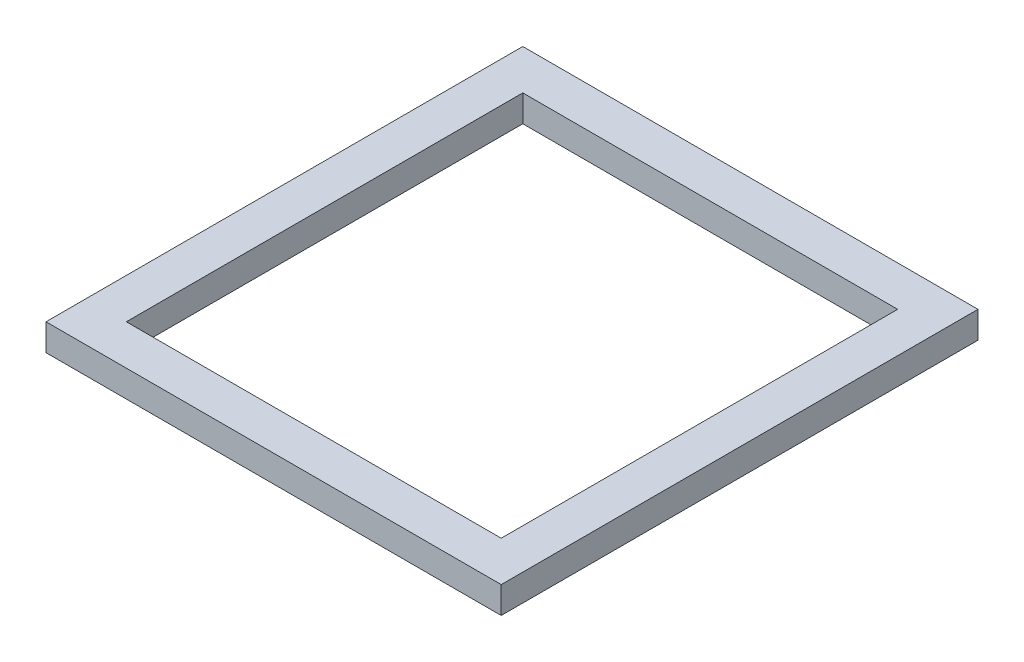
ISO-10303-21;
HEADER;
FILE_DESCRIPTION(('STEP AP214'),'2;1');
FILE_NAME('part.step','',(''),(''),'','','');
FILE_SCHEMA(('AUTOMOTIVE_DESIGN { 1 0 10303 214 1 1 1 1 }'));
ENDSEC;
DATA;
#1=APPLICATION_CONTEXT('core data for automotive mechanical design processes');
#2=APPLICATION_PROTOCOL_DEFINITION('international standard','automotive_design',2000,#1);
#3=PRODUCT_CONTEXT('',#1,'mechanical');
#4=PRODUCT('Part','Part','',(#3));
#5=PRODUCT_RELATED_PRODUCT_CATEGORY('part','',(#4));
#6=PRODUCT_DEFINITION_FORMATION('','',#4);
#7=PRODUCT_DEFINITION_CONTEXT('part definition',#1,'design');
#8=PRODUCT_DEFINITION('design','',#6,#7);
#9=PRODUCT_DEFINITION_SHAPE('','',#8);
#10=(LENGTH_UNIT() NAMED_UNIT(*) SI_UNIT(.MILLI.,.METRE.));
#11=(NAMED_UNIT(*) PLANE_ANGLE_UNIT() SI_UNIT($,.RADIAN.));
#12=(NAMED_UNIT(*) SI_UNIT($,.STERADIAN.) SOLID_ANGLE_UNIT());
#13=UNCERTAINTY_MEASURE_WITH_UNIT(LENGTH_MEASURE(1.E-05),#10,'distance_accuracy_value','');
#14=(GEOMETRIC_REPRESENTATION_CONTEXT(3) GLOBAL_UNCERTAINTY_ASSIGNED_CONTEXT((#13)) GLOBAL_UNIT_ASSIGNED_CONTEXT((#10,
#11,#12)) REPRESENTATION_CONTEXT('',''));
#15=CARTESIAN_POINT('',(0.,0.,0.));
#16=DIRECTION('',(0.,0.,1.));
#17=DIRECTION('',(1.,0.,0.));
#18=AXIS2_PLACEMENT_3D('',#15,#16,#17);
#19=CARTESIAN_POINT('',(0.,1.5875,0.));
#20=DIRECTION('',(0.,-1.,0.));
#21=DIRECTION('',(0.,0.,-1.));
#22=AXIS2_PLACEMENT_3D('',#19,#20,#21);
#23=PLANE('',#22);
#24=DIRECTION('',(0.,0.,1.));
#25=VECTOR('',#24,1.);
#26=CARTESIAN_POINT('',(0.,1.5875,0.));
#27=LINE('',#26,#25);
#28=CARTESIAN_POINT('',(0.,1.5875,-28.2675));
#29=VERTEX_POINT('',#28);
#30=CARTESIAN_POINT('',(0.,1.5875,0.));
#31=VERTEX_POINT('',#30);
#32=EDGE_CURVE('E142',#29,#31,#27,.T.);
#33=ORIENTED_EDGE('',*,*,#32,.T.);
#34=DIRECTION('',(1.,0.,0.));
#35=VECTOR('',#34,1.);
#36=CARTESIAN_POINT('',(0.,1.5875,0.));
#37=LINE('',#36,#35);
#38=CARTESIAN_POINT('',(26.9875,1.5875,0.));
#39=VERTEX_POINT('',#38);
#40=EDGE_CURVE('E145',#31,#39,#37,.T.);
#41=ORIENTED_EDGE('',*,*,#40,.T.);
#42=DIRECTION('',(0.,0.,-1.));
#43=VECTOR('',#42,1.);
#44=CARTESIAN_POINT('',(26.9875,1.5875,0.));
#45=LINE('',#44,#43);
#46=CARTESIAN_POINT('',(26.9875,1.5875,-28.2675));
#47=VERTEX_POINT('',#46);
#48=EDGE_CURVE('E148',#39,#47,#45,.T.);
#49=ORIENTED_EDGE('',*,*,#48,.T.);
#50=DIRECTION('',(-1.,0.,0.));
#51=VECTOR('',#50,1.);
#52=CARTESIAN_POINT('',(0.,1.5875,-28.2675));
#53=LINE('',#52,#51);
#54=EDGE_CURVE('E150',#47,#29,#53,.T.);
#55=ORIENTED_EDGE('',*,*,#54,.T.);
#56=EDGE_LOOP('',(#33,#41,#49,#55));
#57=FACE_BOUND('',#56,.T.);
#58=DIRECTION('',(0.,0.,1.));
#59=VECTOR('',#58,1.);
#60=CARTESIAN_POINT('',(2.38125,1.5875,-2.38125));
#61=LINE('',#60,#59);
#62=CARTESIAN_POINT('',(2.38125,1.5875,-25.88625));
#63=VERTEX_POINT('',#62);
#64=CARTESIAN_POINT('',(2.38125,1.5875,-2.38125));
#65=VERTEX_POINT('',#64);
#66=EDGE_CURVE('E106',#63,#65,#61,.T.);
#67=ORIENTED_EDGE('',*,*,#66,.F.);
#68=DIRECTION('',(-1.,0.,0.));
#69=VECTOR('',#68,1.);
#70=CARTESIAN_POINT('',(2.38125,1.5875,-25.88625));
#71=LINE('',#70,#69);
#72=CARTESIAN_POINT('',(24.60625,1.5875,-25.88625));
#73=VERTEX_POINT('',#72);
#74=EDGE_CURVE('E128',#73,#63,#71,.T.);
#75=ORIENTED_EDGE('',*,*,#74,.F.);
#76=DIRECTION('',(0.,0.,-1.));
#77=VECTOR('',#76,1.);
#78=CARTESIAN_POINT('',(24.60625,1.5875,-2.38125));
#79=LINE('',#78,#77);
#80=CARTESIAN_POINT('',(24.60625,1.5875,-2.38125));
#81=VERTEX_POINT('',#80);
#82=EDGE_CURVE('E126',#81,#73,#79,.T.);
#83=ORIENTED_EDGE('',*,*,#82,.F.);
#84=DIRECTION('',(1.,0.,0.));
#85=VECTOR('',#84,1.);
#86=CARTESIAN_POINT('',(2.38125,1.5875,-2.38125));
#87=LINE('',#86,#85);
#88=EDGE_CURVE('E114',#65,#81,#87,.T.);
#89=ORIENTED_EDGE('',*,*,#88,.F.);
#90=EDGE_LOOP('',(#67,#75,#83,#89));
#91=FACE_BOUND('',#90,.T.);
#92=ADVANCED_FACE('F41',(#57,#91),#23,.F.);
#93=CARTESIAN_POINT('',(0.,0.,0.));
#94=DIRECTION('',(0.,-1.,0.));
#95=DIRECTION('',(0.,0.,-1.));
#96=AXIS2_PLACEMENT_3D('',#93,#94,#95);
#97=PLANE('',#96);
#98=DIRECTION('',(0.,0.,1.));
#99=VECTOR('',#98,1.);
#100=CARTESIAN_POINT('',(0.,0.,0.));
#101=LINE('',#100,#99);
#102=CARTESIAN_POINT('',(0.,0.,-28.2675));
#103=VERTEX_POINT('',#102);
#104=CARTESIAN_POINT('',(0.,0.,0.));
#105=VERTEX_POINT('',#104);
#106=EDGE_CURVE('E122',#103,#105,#101,.T.);
#107=ORIENTED_EDGE('',*,*,#106,.F.);
#108=DIRECTION('',(-1.,0.,0.));
#109=VECTOR('',#108,1.);
#110=CARTESIAN_POINT('',(0.,0.,-28.2675));
#111=LINE('',#110,#109);
#112=CARTESIAN_POINT('',(26.9875,0.,-28.2675));
#113=VERTEX_POINT('',#112);
#114=EDGE_CURVE('E146',#113,#103,#111,.T.);
#115=ORIENTED_EDGE('',*,*,#114,.F.);
#116=DIRECTION('',(0.,0.,-1.));
#117=VECTOR('',#116,1.);
#118=CARTESIAN_POINT('',(26.9875,0.,0.));
#119=LINE('',#118,#117);
#120=CARTESIAN_POINT('',(26.9875,0.,0.));
#121=VERTEX_POINT('',#120);
#122=EDGE_CURVE('E157',#121,#113,#119,.T.);
#123=ORIENTED_EDGE('',*,*,#122,.F.);
#124=DIRECTION('',(1.,0.,0.));
#125=VECTOR('',#124,1.);
#126=CARTESIAN_POINT('',(0.,0.,0.));
#127=LINE('',#126,#125);
#128=EDGE_CURVE('E155',#105,#121,#127,.T.);
#129=ORIENTED_EDGE('',*,*,#128,.F.);
#130=EDGE_LOOP('',(#107,#115,#123,#129));
#131=FACE_BOUND('',#130,.T.);
#132=DIRECTION('',(-1.,0.,0.));
#133=VECTOR('',#132,1.);
#134=CARTESIAN_POINT('',(2.38125,0.,-25.88625));
#135=LINE('',#134,#133);
#136=CARTESIAN_POINT('',(24.60625,0.,-25.88625));
#137=VERTEX_POINT('',#136);
#138=CARTESIAN_POINT('',(2.38125,0.,-25.88625));
#139=VERTEX_POINT('',#138);
#140=EDGE_CURVE('E115',#137,#139,#135,.T.);
#141=ORIENTED_EDGE('',*,*,#140,.T.);
#142=DIRECTION('',(0.,0.,1.));
#143=VECTOR('',#142,1.);
#144=CARTESIAN_POINT('',(2.38125,0.,-2.38125));
#145=LINE('',#144,#143);
#146=CARTESIAN_POINT('',(2.38125,0.,-2.38125));
#147=VERTEX_POINT('',#146);
#148=EDGE_CURVE('E64',#139,#147,#145,.T.);
#149=ORIENTED_EDGE('',*,*,#148,.T.);
#150=DIRECTION('',(1.,0.,0.));
#151=VECTOR('',#150,1.);
#152=CARTESIAN_POINT('',(2.38125,0.,-2.38125));
#153=LINE('',#152,#151);
#154=CARTESIAN_POINT('',(24.60625,0.,-2.38125));
#155=VERTEX_POINT('',#154);
#156=EDGE_CURVE('E121',#147,#155,#153,.T.);
#157=ORIENTED_EDGE('',*,*,#156,.T.);
#158=DIRECTION('',(0.,0.,-1.));
#159=VECTOR('',#158,1.);
#160=CARTESIAN_POINT('',(24.60625,0.,-2.38125));
#161=LINE('',#160,#159);
#162=EDGE_CURVE('E134',#155,#137,#161,.T.);
#163=ORIENTED_EDGE('',*,*,#162,.T.);
#164=EDGE_LOOP('',(#141,#149,#157,#163));
#165=FACE_BOUND('',#164,.T.);
#166=ADVANCED_FACE('F175',(#131,#165),#97,.T.);
#167=CARTESIAN_POINT('',(0.,1.5875,0.));
#168=DIRECTION('',(1.,0.,0.));
#169=DIRECTION('',(0.,0.,-1.));
#170=AXIS2_PLACEMENT_3D('',#167,#168,#169);
#171=PLANE('',#170);
#172=ORIENTED_EDGE('',*,*,#106,.T.);
#173=DIRECTION('',(0.,-1.,0.));
#174=VECTOR('',#173,1.);
#175=CARTESIAN_POINT('',(0.,1.5875,0.));
#176=LINE('',#175,#174);
#177=EDGE_CURVE('E11',#31,#105,#176,.T.);
#178=ORIENTED_EDGE('',*,*,#177,.F.);
#179=ORIENTED_EDGE('',*,*,#32,.F.);
#180=DIRECTION('',(0.,-1.,0.));
#181=VECTOR('',#180,1.);
#182=CARTESIAN_POINT('',(0.,1.5875,-28.2675));
#183=LINE('',#182,#181);
#184=EDGE_CURVE('E152',#29,#103,#183,.T.);
#185=ORIENTED_EDGE('',*,*,#184,.T.);
#186=EDGE_LOOP('',(#172,#178,#179,#185));
#187=FACE_BOUND('',#186,.T.);
#188=ADVANCED_FACE('F43',(#187),#171,.F.);
#189=CARTESIAN_POINT('',(0.,1.5875,0.));
#190=DIRECTION('',(0.,0.,-1.));
#191=DIRECTION('',(-1.,0.,0.));
#192=AXIS2_PLACEMENT_3D('',#189,#190,#191);
#193=PLANE('',#192);
#194=ORIENTED_EDGE('',*,*,#128,.T.);
#195=DIRECTION('',(0.,-1.,0.));
#196=VECTOR('',#195,1.);
#197=CARTESIAN_POINT('',(26.9875,1.5875,0.));
#198=LINE('',#197,#196);
#199=EDGE_CURVE('E49',#39,#121,#198,.T.);
#200=ORIENTED_EDGE('',*,*,#199,.F.);
#201=ORIENTED_EDGE('',*,*,#40,.F.);
#202=ORIENTED_EDGE('',*,*,#177,.T.);
#203=EDGE_LOOP('',(#194,#200,#201,#202));
#204=FACE_BOUND('',#203,.T.);
#205=ADVANCED_FACE('F185',(#204),#193,.F.);
#206=CARTESIAN_POINT('',(26.9875,1.5875,0.));
#207=DIRECTION('',(-1.,0.,0.));
#208=DIRECTION('',(0.,0.,1.));
#209=AXIS2_PLACEMENT_3D('',#206,#207,#208);
#210=PLANE('',#209);
#211=ORIENTED_EDGE('',*,*,#122,.T.);
#212=DIRECTION('',(0.,-1.,0.));
#213=VECTOR('',#212,1.);
#214=CARTESIAN_POINT('',(26.9875,1.5875,-28.2675));
#215=LINE('',#214,#213);
#216=EDGE_CURVE('E162',#47,#113,#215,.T.);
#217=ORIENTED_EDGE('',*,*,#216,.F.);
#218=ORIENTED_EDGE('',*,*,#48,.F.);
#219=ORIENTED_EDGE('',*,*,#199,.T.);
#220=EDGE_LOOP('',(#211,#217,#218,#219));
#221=FACE_BOUND('',#220,.T.);
#222=ADVANCED_FACE('F169',(#221),#210,.F.);
#223=CARTESIAN_POINT('',(0.,1.5875,-28.2675));
#224=DIRECTION('',(0.,0.,1.));
#225=DIRECTION('',(1.,0.,0.));
#226=AXIS2_PLACEMENT_3D('',#223,#224,#225);
#227=PLANE('',#226);
#228=ORIENTED_EDGE('',*,*,#114,.T.);
#229=ORIENTED_EDGE('',*,*,#184,.F.);
#230=ORIENTED_EDGE('',*,*,#54,.F.);
#231=ORIENTED_EDGE('',*,*,#216,.T.);
#232=EDGE_LOOP('',(#228,#229,#230,#231));
#233=FACE_BOUND('',#232,.T.);
#234=ADVANCED_FACE('F179',(#233),#227,.F.);
#235=CARTESIAN_POINT('',(2.38125,1.5875,-2.38125));
#236=DIRECTION('',(1.,0.,0.));
#237=DIRECTION('',(0.,0.,-1.));
#238=AXIS2_PLACEMENT_3D('',#235,#236,#237);
#239=PLANE('',#238);
#240=ORIENTED_EDGE('',*,*,#148,.F.);
#241=DIRECTION('',(0.,-1.,0.));
#242=VECTOR('',#241,1.);
#243=CARTESIAN_POINT('',(2.38125,1.5875,-25.88625));
#244=LINE('',#243,#242);
#245=EDGE_CURVE('E110',#63,#139,#244,.T.);
#246=ORIENTED_EDGE('',*,*,#245,.F.);
#247=ORIENTED_EDGE('',*,*,#66,.T.);
#248=DIRECTION('',(0.,-1.,0.));
#249=VECTOR('',#248,1.);
#250=CARTESIAN_POINT('',(2.38125,1.5875,-2.38125));
#251=LINE('',#250,#249);
#252=EDGE_CURVE('E109',#65,#147,#251,.T.);
#253=ORIENTED_EDGE('',*,*,#252,.T.);
#254=EDGE_LOOP('',(#240,#246,#247,#253));
#255=FACE_BOUND('',#254,.T.);
#256=ADVANCED_FACE('F108',(#255),#239,.T.);
#257=CARTESIAN_POINT('',(2.38125,1.5875,-2.38125));
#258=DIRECTION('',(0.,0.,-1.));
#259=DIRECTION('',(-1.,0.,0.));
#260=AXIS2_PLACEMENT_3D('',#257,#258,#259);
#261=PLANE('',#260);
#262=ORIENTED_EDGE('',*,*,#156,.F.);
#263=ORIENTED_EDGE('',*,*,#252,.F.);
#264=ORIENTED_EDGE('',*,*,#88,.T.);
#265=DIRECTION('',(0.,-1.,0.));
#266=VECTOR('',#265,1.);
#267=CARTESIAN_POINT('',(24.60625,1.5875,-2.38125));
#268=LINE('',#267,#266);
#269=EDGE_CURVE('E123',#81,#155,#268,.T.);
#270=ORIENTED_EDGE('',*,*,#269,.T.);
#271=EDGE_LOOP('',(#262,#263,#264,#270));
#272=FACE_BOUND('',#271,.T.);
#273=ADVANCED_FACE('F118',(#272),#261,.T.);
#274=CARTESIAN_POINT('',(24.60625,1.5875,-2.38125));
#275=DIRECTION('',(-1.,0.,0.));
#276=DIRECTION('',(0.,0.,1.));
#277=AXIS2_PLACEMENT_3D('',#274,#275,#276);
#278=PLANE('',#277);
#279=ORIENTED_EDGE('',*,*,#162,.F.);
#280=ORIENTED_EDGE('',*,*,#269,.F.);
#281=ORIENTED_EDGE('',*,*,#82,.T.);
#282=DIRECTION('',(0.,-1.,0.));
#283=VECTOR('',#282,1.);
#284=CARTESIAN_POINT('',(24.60625,1.5875,-25.88625));
#285=LINE('',#284,#283);
#286=EDGE_CURVE('E56',#73,#137,#285,.T.);
#287=ORIENTED_EDGE('',*,*,#286,.T.);
#288=EDGE_LOOP('',(#279,#280,#281,#287));
#289=FACE_BOUND('',#288,.T.);
#290=ADVANCED_FACE('F208',(#289),#278,.T.);
#291=CARTESIAN_POINT('',(2.38125,1.5875,-25.88625));
#292=DIRECTION('',(0.,0.,1.));
#293=DIRECTION('',(1.,0.,0.));
#294=AXIS2_PLACEMENT_3D('',#291,#292,#293);
#295=PLANE('',#294);
#296=ORIENTED_EDGE('',*,*,#140,.F.);
#297=ORIENTED_EDGE('',*,*,#286,.F.);
#298=ORIENTED_EDGE('',*,*,#74,.T.);
#299=ORIENTED_EDGE('',*,*,#245,.T.);
#300=EDGE_LOOP('',(#296,#297,#298,#299));
#301=FACE_BOUND('',#300,.T.);
#302=ADVANCED_FACE('F212',(#301),#295,.T.);
#303=CLOSED_SHELL('',(#92,#166,#188,#205,#222,#234,#256,#273,#290,#302));
#304=MANIFOLD_SOLID_BREP('B2',#303);
#305=ADVANCED_BREP_SHAPE_REPRESENTATION('',(#18,#304),#14);
#306=SHAPE_DEFINITION_REPRESENTATION(#9,#305);
ENDSEC;
END-ISO-10303-21;
